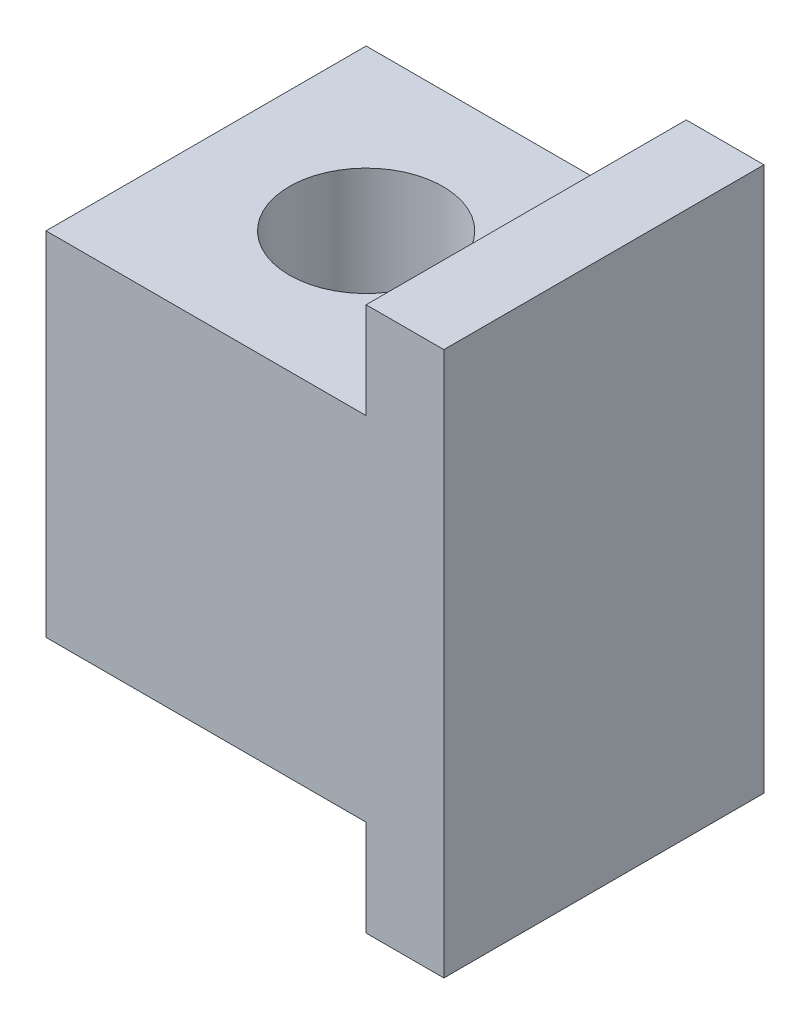
ISO-10303-21;
HEADER;
FILE_DESCRIPTION(('STEP AP214'),'2;1');
FILE_NAME('part.step','',(''),(''),'','','');
FILE_SCHEMA(('AUTOMOTIVE_DESIGN { 1 0 10303 214 1 1 1 1 }'));
ENDSEC;
DATA;
#1=APPLICATION_CONTEXT('core data for automotive mechanical design processes');
#2=APPLICATION_PROTOCOL_DEFINITION('international standard','automotive_design',2000,#1);
#3=PRODUCT_CONTEXT('',#1,'mechanical');
#4=PRODUCT('Part','Part','',(#3));
#5=PRODUCT_RELATED_PRODUCT_CATEGORY('part','',(#4));
#6=PRODUCT_DEFINITION_FORMATION('','',#4);
#7=PRODUCT_DEFINITION_CONTEXT('part definition',#1,'design');
#8=PRODUCT_DEFINITION('design','',#6,#7);
#9=PRODUCT_DEFINITION_SHAPE('','',#8);
#10=(LENGTH_UNIT() NAMED_UNIT(*) SI_UNIT(.MILLI.,.METRE.));
#11=(NAMED_UNIT(*) PLANE_ANGLE_UNIT() SI_UNIT($,.RADIAN.));
#12=(NAMED_UNIT(*) SI_UNIT($,.STERADIAN.) SOLID_ANGLE_UNIT());
#13=UNCERTAINTY_MEASURE_WITH_UNIT(LENGTH_MEASURE(1.E-05),#10,'distance_accuracy_value','');
#14=(GEOMETRIC_REPRESENTATION_CONTEXT(3) GLOBAL_UNCERTAINTY_ASSIGNED_CONTEXT((#13)) GLOBAL_UNIT_ASSIGNED_CONTEXT((#10,
#11,#12)) REPRESENTATION_CONTEXT('',''));
#15=CARTESIAN_POINT('',(0.,0.,0.));
#16=DIRECTION('',(0.,0.,1.));
#17=DIRECTION('',(1.,0.,0.));
#18=AXIS2_PLACEMENT_3D('',#15,#16,#17);
#19=CARTESIAN_POINT('',(0.,0.,12.7));
#20=DIRECTION('',(1.,0.,0.));
#21=DIRECTION('',(0.,0.,-1.));
#22=AXIS2_PLACEMENT_3D('',#19,#20,#21);
#23=PLANE('',#22);
#24=DIRECTION('',(0.,-1.,0.));
#25=VECTOR('',#24,1.);
#26=CARTESIAN_POINT('',(0.,0.,0.));
#27=LINE('',#26,#25);
#28=CARTESIAN_POINT('',(0.,0.,0.));
#29=VERTEX_POINT('',#28);
#30=CARTESIAN_POINT('',(0.,-13.97,0.));
#31=VERTEX_POINT('',#30);
#32=EDGE_CURVE('E140',#29,#31,#27,.T.);
#33=ORIENTED_EDGE('',*,*,#32,.T.);
#34=DIRECTION('',(0.,0.,-1.));
#35=VECTOR('',#34,1.);
#36=CARTESIAN_POINT('',(0.,-13.97,12.7));
#37=LINE('',#36,#35);
#38=CARTESIAN_POINT('',(0.,-13.97,12.7));
#39=VERTEX_POINT('',#38);
#40=EDGE_CURVE('E11',#39,#31,#37,.T.);
#41=ORIENTED_EDGE('',*,*,#40,.F.);
#42=DIRECTION('',(0.,-1.,0.));
#43=VECTOR('',#42,1.);
#44=CARTESIAN_POINT('',(0.,0.,12.7));
#45=LINE('',#44,#43);
#46=CARTESIAN_POINT('',(0.,0.,12.7));
#47=VERTEX_POINT('',#46);
#48=EDGE_CURVE('E163',#47,#39,#45,.T.);
#49=ORIENTED_EDGE('',*,*,#48,.F.);
#50=DIRECTION('',(0.,0.,-1.));
#51=VECTOR('',#50,1.);
#52=CARTESIAN_POINT('',(0.,0.,12.7));
#53=LINE('',#52,#51);
#54=EDGE_CURVE('E136',#47,#29,#53,.T.);
#55=ORIENTED_EDGE('',*,*,#54,.T.);
#56=EDGE_LOOP('',(#33,#41,#49,#55));
#57=FACE_BOUND('',#56,.T.);
#58=ADVANCED_FACE('F39',(#57),#23,.F.);
#59=CARTESIAN_POINT('',(0.,-13.97,12.7));
#60=DIRECTION('',(0.,1.,0.));
#61=DIRECTION('',(0.,0.,1.));
#62=AXIS2_PLACEMENT_3D('',#59,#60,#61);
#63=PLANE('',#62);
#64=CARTESIAN_POINT('',(6.35,-13.97,6.35));
#65=DIRECTION('',(0.,1.,0.));
#66=DIRECTION('',(0.,0.,1.));
#67=AXIS2_PLACEMENT_3D('',#64,#65,#66);
#68=CIRCLE('',#67,3.048);
#69=CARTESIAN_POINT('',(6.35,-13.97,9.398));
#70=VERTEX_POINT('',#69);
#71=EDGE_CURVE('E145',#70,#70,#68,.T.);
#72=ORIENTED_EDGE('',*,*,#71,.T.);
#73=EDGE_LOOP('',(#72));
#74=FACE_BOUND('',#73,.T.);
#75=DIRECTION('',(1.,0.,0.));
#76=VECTOR('',#75,1.);
#77=CARTESIAN_POINT('',(0.,-13.97,0.));
#78=LINE('',#77,#76);
#79=CARTESIAN_POINT('',(12.7,-13.97,0.));
#80=VERTEX_POINT('',#79);
#81=EDGE_CURVE('E144',#31,#80,#78,.T.);
#82=ORIENTED_EDGE('',*,*,#81,.T.);
#83=DIRECTION('',(0.,0.,-1.));
#84=VECTOR('',#83,1.);
#85=CARTESIAN_POINT('',(12.7,-13.97,12.7));
#86=LINE('',#85,#84);
#87=CARTESIAN_POINT('',(12.7,-13.97,12.7));
#88=VERTEX_POINT('',#87);
#89=EDGE_CURVE('E48',#88,#80,#86,.T.);
#90=ORIENTED_EDGE('',*,*,#89,.F.);
#91=DIRECTION('',(1.,0.,0.));
#92=VECTOR('',#91,1.);
#93=CARTESIAN_POINT('',(0.,-13.97,12.7));
#94=LINE('',#93,#92);
#95=EDGE_CURVE('E99',#39,#88,#94,.T.);
#96=ORIENTED_EDGE('',*,*,#95,.F.);
#97=ORIENTED_EDGE('',*,*,#40,.T.);
#98=EDGE_LOOP('',(#82,#90,#96,#97));
#99=FACE_BOUND('',#98,.T.);
#100=ADVANCED_FACE('F229',(#74,#99),#63,.F.);
#101=CARTESIAN_POINT('',(12.7,-17.78,12.7));
#102=DIRECTION('',(1.,0.,0.));
#103=DIRECTION('',(0.,1.,0.));
#104=AXIS2_PLACEMENT_3D('',#101,#102,#103);
#105=PLANE('',#104);
#106=DIRECTION('',(0.,-1.,0.));
#107=VECTOR('',#106,1.);
#108=CARTESIAN_POINT('',(12.7,-17.78,0.));
#109=LINE('',#108,#107);
#110=CARTESIAN_POINT('',(12.7,-17.78,0.));
#111=VERTEX_POINT('',#110);
#112=EDGE_CURVE('E148',#80,#111,#109,.T.);
#113=ORIENTED_EDGE('',*,*,#112,.T.);
#114=DIRECTION('',(0.,0.,-1.));
#115=VECTOR('',#114,1.);
#116=CARTESIAN_POINT('',(12.7,-17.78,12.7));
#117=LINE('',#116,#115);
#118=CARTESIAN_POINT('',(12.7,-17.78,12.7));
#119=VERTEX_POINT('',#118);
#120=EDGE_CURVE('E174',#119,#111,#117,.T.);
#121=ORIENTED_EDGE('',*,*,#120,.F.);
#122=DIRECTION('',(0.,-1.,0.));
#123=VECTOR('',#122,1.);
#124=CARTESIAN_POINT('',(12.7,-17.78,12.7));
#125=LINE('',#124,#123);
#126=EDGE_CURVE('E184',#88,#119,#125,.T.);
#127=ORIENTED_EDGE('',*,*,#126,.F.);
#128=ORIENTED_EDGE('',*,*,#89,.T.);
#129=EDGE_LOOP('',(#113,#121,#127,#128));
#130=FACE_BOUND('',#129,.T.);
#131=ADVANCED_FACE('F182',(#130),#105,.F.);
#132=CARTESIAN_POINT('',(15.7828234051938,-17.78,12.7));
#133=DIRECTION('',(0.,1.,0.));
#134=DIRECTION('',(0.,0.,1.));
#135=AXIS2_PLACEMENT_3D('',#132,#133,#134);
#136=PLANE('',#135);
#137=DIRECTION('',(1.,0.,0.));
#138=VECTOR('',#137,1.);
#139=CARTESIAN_POINT('',(15.7828234051938,-17.78,0.));
#140=LINE('',#139,#138);
#141=CARTESIAN_POINT('',(15.7828234051938,-17.78,0.));
#142=VERTEX_POINT('',#141);
#143=EDGE_CURVE('E151',#111,#142,#140,.T.);
#144=ORIENTED_EDGE('',*,*,#143,.T.);
#145=DIRECTION('',(0.,0.,-1.));
#146=VECTOR('',#145,1.);
#147=CARTESIAN_POINT('',(15.7828234051938,-17.78,12.7));
#148=LINE('',#147,#146);
#149=CARTESIAN_POINT('',(15.7828234051938,-17.78,12.7));
#150=VERTEX_POINT('',#149);
#151=EDGE_CURVE('E170',#150,#142,#148,.T.);
#152=ORIENTED_EDGE('',*,*,#151,.F.);
#153=DIRECTION('',(1.,0.,0.));
#154=VECTOR('',#153,1.);
#155=CARTESIAN_POINT('',(15.7828234051938,-17.78,12.7));
#156=LINE('',#155,#154);
#157=EDGE_CURVE('E197',#119,#150,#156,.T.);
#158=ORIENTED_EDGE('',*,*,#157,.F.);
#159=ORIENTED_EDGE('',*,*,#120,.T.);
#160=EDGE_LOOP('',(#144,#152,#158,#159));
#161=FACE_BOUND('',#160,.T.);
#162=ADVANCED_FACE('F192',(#161),#136,.F.);
#163=CARTESIAN_POINT('',(15.7828234051938,3.81,12.7));
#164=DIRECTION('',(-1.,0.,0.));
#165=DIRECTION('',(0.,-1.,0.));
#166=AXIS2_PLACEMENT_3D('',#163,#164,#165);
#167=PLANE('',#166);
#168=DIRECTION('',(0.,1.,0.));
#169=VECTOR('',#168,1.);
#170=CARTESIAN_POINT('',(15.7828234051938,3.81,0.));
#171=LINE('',#170,#169);
#172=CARTESIAN_POINT('',(15.7828234051938,3.81,0.));
#173=VERTEX_POINT('',#172);
#174=EDGE_CURVE('E154',#142,#173,#171,.T.);
#175=ORIENTED_EDGE('',*,*,#174,.T.);
#176=DIRECTION('',(0.,0.,-1.));
#177=VECTOR('',#176,1.);
#178=CARTESIAN_POINT('',(15.7828234051938,3.81,12.7));
#179=LINE('',#178,#177);
#180=CARTESIAN_POINT('',(15.7828234051938,3.81,12.7));
#181=VERTEX_POINT('',#180);
#182=EDGE_CURVE('E129',#181,#173,#179,.T.);
#183=ORIENTED_EDGE('',*,*,#182,.F.);
#184=DIRECTION('',(0.,1.,0.));
#185=VECTOR('',#184,1.);
#186=CARTESIAN_POINT('',(15.7828234051938,3.81,12.7));
#187=LINE('',#186,#185);
#188=EDGE_CURVE('E118',#150,#181,#187,.T.);
#189=ORIENTED_EDGE('',*,*,#188,.F.);
#190=ORIENTED_EDGE('',*,*,#151,.T.);
#191=EDGE_LOOP('',(#175,#183,#189,#190));
#192=FACE_BOUND('',#191,.T.);
#193=ADVANCED_FACE('F195',(#192),#167,.F.);
#194=CARTESIAN_POINT('',(12.7,3.81,12.7));
#195=DIRECTION('',(0.,-1.,0.));
#196=DIRECTION('',(0.,0.,-1.));
#197=AXIS2_PLACEMENT_3D('',#194,#195,#196);
#198=PLANE('',#197);
#199=DIRECTION('',(-1.,0.,0.));
#200=VECTOR('',#199,1.);
#201=CARTESIAN_POINT('',(12.7,3.81,0.));
#202=LINE('',#201,#200);
#203=CARTESIAN_POINT('',(12.7,3.81,0.));
#204=VERTEX_POINT('',#203);
#205=EDGE_CURVE('E127',#173,#204,#202,.T.);
#206=ORIENTED_EDGE('',*,*,#205,.T.);
#207=DIRECTION('',(0.,0.,-1.));
#208=VECTOR('',#207,1.);
#209=CARTESIAN_POINT('',(12.7,3.81,12.7));
#210=LINE('',#209,#208);
#211=CARTESIAN_POINT('',(12.7,3.81,12.7));
#212=VERTEX_POINT('',#211);
#213=EDGE_CURVE('E124',#212,#204,#210,.T.);
#214=ORIENTED_EDGE('',*,*,#213,.F.);
#215=DIRECTION('',(-1.,0.,0.));
#216=VECTOR('',#215,1.);
#217=CARTESIAN_POINT('',(12.7,3.81,12.7));
#218=LINE('',#217,#216);
#219=EDGE_CURVE('E112',#181,#212,#218,.T.);
#220=ORIENTED_EDGE('',*,*,#219,.F.);
#221=ORIENTED_EDGE('',*,*,#182,.T.);
#222=EDGE_LOOP('',(#206,#214,#220,#221));
#223=FACE_BOUND('',#222,.T.);
#224=ADVANCED_FACE('F125',(#223),#198,.F.);
#225=CARTESIAN_POINT('',(12.7,0.,12.7));
#226=DIRECTION('',(1.,0.,0.));
#227=DIRECTION('',(0.,0.,-1.));
#228=AXIS2_PLACEMENT_3D('',#225,#226,#227);
#229=PLANE('',#228);
#230=DIRECTION('',(0.,-1.,0.));
#231=VECTOR('',#230,1.);
#232=CARTESIAN_POINT('',(12.7,0.,0.));
#233=LINE('',#232,#231);
#234=CARTESIAN_POINT('',(12.7,0.,0.));
#235=VERTEX_POINT('',#234);
#236=EDGE_CURVE('E85',#204,#235,#233,.T.);
#237=ORIENTED_EDGE('',*,*,#236,.T.);
#238=DIRECTION('',(0.,0.,-1.));
#239=VECTOR('',#238,1.);
#240=CARTESIAN_POINT('',(12.7,0.,12.7));
#241=LINE('',#240,#239);
#242=CARTESIAN_POINT('',(12.7,0.,12.7));
#243=VERTEX_POINT('',#242);
#244=EDGE_CURVE('E130',#243,#235,#241,.T.);
#245=ORIENTED_EDGE('',*,*,#244,.F.);
#246=DIRECTION('',(0.,-1.,0.));
#247=VECTOR('',#246,1.);
#248=CARTESIAN_POINT('',(12.7,0.,12.7));
#249=LINE('',#248,#247);
#250=EDGE_CURVE('E116',#212,#243,#249,.T.);
#251=ORIENTED_EDGE('',*,*,#250,.F.);
#252=ORIENTED_EDGE('',*,*,#213,.T.);
#253=EDGE_LOOP('',(#237,#245,#251,#252));
#254=FACE_BOUND('',#253,.T.);
#255=ADVANCED_FACE('F132',(#254),#229,.F.);
#256=CARTESIAN_POINT('',(0.,0.,12.7));
#257=DIRECTION('',(0.,-1.,0.));
#258=DIRECTION('',(0.,0.,-1.));
#259=AXIS2_PLACEMENT_3D('',#256,#257,#258);
#260=PLANE('',#259);
#261=CARTESIAN_POINT('',(6.35,0.,6.35));
#262=DIRECTION('',(0.,1.,0.));
#263=DIRECTION('',(0.,0.,1.));
#264=AXIS2_PLACEMENT_3D('',#261,#262,#263);
#265=CIRCLE('',#264,3.048);
#266=CARTESIAN_POINT('',(6.35,0.,9.398));
#267=VERTEX_POINT('',#266);
#268=EDGE_CURVE('E210',#267,#267,#265,.T.);
#269=ORIENTED_EDGE('',*,*,#268,.F.);
#270=EDGE_LOOP('',(#269));
#271=FACE_BOUND('',#270,.T.);
#272=DIRECTION('',(-1.,0.,0.));
#273=VECTOR('',#272,1.);
#274=CARTESIAN_POINT('',(0.,0.,0.));
#275=LINE('',#274,#273);
#276=EDGE_CURVE('E91',#235,#29,#275,.T.);
#277=ORIENTED_EDGE('',*,*,#276,.T.);
#278=ORIENTED_EDGE('',*,*,#54,.F.);
#279=DIRECTION('',(-1.,0.,0.));
#280=VECTOR('',#279,1.);
#281=CARTESIAN_POINT('',(0.,0.,12.7));
#282=LINE('',#281,#280);
#283=EDGE_CURVE('E56',#243,#47,#282,.T.);
#284=ORIENTED_EDGE('',*,*,#283,.F.);
#285=ORIENTED_EDGE('',*,*,#244,.T.);
#286=EDGE_LOOP('',(#277,#278,#284,#285));
#287=FACE_BOUND('',#286,.T.);
#288=ADVANCED_FACE('F218',(#271,#287),#260,.F.);
#289=CARTESIAN_POINT('',(0.,0.,12.7));
#290=DIRECTION('',(0.,0.,1.));
#291=DIRECTION('',(1.,0.,0.));
#292=AXIS2_PLACEMENT_3D('',#289,#290,#291);
#293=PLANE('',#292);
#294=ORIENTED_EDGE('',*,*,#48,.T.);
#295=ORIENTED_EDGE('',*,*,#95,.T.);
#296=ORIENTED_EDGE('',*,*,#126,.T.);
#297=ORIENTED_EDGE('',*,*,#157,.T.);
#298=ORIENTED_EDGE('',*,*,#188,.T.);
#299=ORIENTED_EDGE('',*,*,#219,.T.);
#300=ORIENTED_EDGE('',*,*,#250,.T.);
#301=ORIENTED_EDGE('',*,*,#283,.T.);
#302=EDGE_LOOP('',(#294,#295,#296,#297,#298,#299,#300,#301));
#303=FACE_BOUND('',#302,.T.);
#304=ADVANCED_FACE('F114',(#303),#293,.T.);
#305=CARTESIAN_POINT('',(0.,0.,0.));
#306=DIRECTION('',(0.,0.,1.));
#307=DIRECTION('',(1.,0.,0.));
#308=AXIS2_PLACEMENT_3D('',#305,#306,#307);
#309=PLANE('',#308);
#310=ORIENTED_EDGE('',*,*,#32,.F.);
#311=ORIENTED_EDGE('',*,*,#276,.F.);
#312=ORIENTED_EDGE('',*,*,#236,.F.);
#313=ORIENTED_EDGE('',*,*,#205,.F.);
#314=ORIENTED_EDGE('',*,*,#174,.F.);
#315=ORIENTED_EDGE('',*,*,#143,.F.);
#316=ORIENTED_EDGE('',*,*,#112,.F.);
#317=ORIENTED_EDGE('',*,*,#81,.F.);
#318=EDGE_LOOP('',(#310,#311,#312,#313,#314,#315,#316,#317));
#319=FACE_BOUND('',#318,.T.);
#320=ADVANCED_FACE('F188',(#319),#309,.F.);
#321=CARTESIAN_POINT('',(6.35,-17.78,6.35));
#322=DIRECTION('',(0.,1.,0.));
#323=DIRECTION('',(0.,0.,1.));
#324=AXIS2_PLACEMENT_3D('',#321,#322,#323);
#325=CYLINDRICAL_SURFACE('',#324,3.048);
#326=CARTESIAN_POINT('',(6.35,0.,9.398));
#327=CARTESIAN_POINT('',(6.35,-0.145520833333334,9.398));
#328=CARTESIAN_POINT('',(6.35,-0.291041666666667,9.398));
#329=CARTESIAN_POINT('',(6.35,-0.582083333333334,9.398));
#330=CARTESIAN_POINT('',(6.35,-0.727604166666666,9.398));
#331=CARTESIAN_POINT('',(6.35,-1.01864583333333,9.398));
#332=CARTESIAN_POINT('',(6.35,-1.16416666666667,9.398));
#333=CARTESIAN_POINT('',(6.35,-1.45520833333333,9.398));
#334=CARTESIAN_POINT('',(6.35,-1.60072916666667,9.398));
#335=CARTESIAN_POINT('',(6.35,-1.89177083333333,9.398));
#336=CARTESIAN_POINT('',(6.35,-2.03729166666667,9.398));
#337=CARTESIAN_POINT('',(6.35,-2.32833333333333,9.398));
#338=CARTESIAN_POINT('',(6.35,-2.47385416666667,9.398));
#339=CARTESIAN_POINT('',(6.35,-2.76489583333333,9.398));
#340=CARTESIAN_POINT('',(6.35,-2.91041666666667,9.398));
#341=CARTESIAN_POINT('',(6.35,-3.20145833333333,9.398));
#342=CARTESIAN_POINT('',(6.35,-3.34697916666667,9.398));
#343=CARTESIAN_POINT('',(6.35,-3.63802083333333,9.398));
#344=CARTESIAN_POINT('',(6.35,-3.78354166666667,9.398));
#345=CARTESIAN_POINT('',(6.35,-4.07458333333333,9.398));
#346=CARTESIAN_POINT('',(6.35,-4.22010416666667,9.398));
#347=CARTESIAN_POINT('',(6.35,-4.51114583333333,9.398));
#348=CARTESIAN_POINT('',(6.35,-4.65666666666667,9.398));
#349=CARTESIAN_POINT('',(6.35,-4.94770833333333,9.398));
#350=CARTESIAN_POINT('',(6.35,-5.09322916666667,9.398));
#351=CARTESIAN_POINT('',(6.35,-5.38427083333333,9.398));
#352=CARTESIAN_POINT('',(6.35,-5.52979166666667,9.398));
#353=CARTESIAN_POINT('',(6.35,-5.82083333333333,9.398));
#354=CARTESIAN_POINT('',(6.35,-5.96635416666667,9.398));
#355=CARTESIAN_POINT('',(6.35,-6.25739583333333,9.398));
#356=CARTESIAN_POINT('',(6.35,-6.40291666666667,9.398));
#357=CARTESIAN_POINT('',(6.35,-6.69395833333333,9.398));
#358=CARTESIAN_POINT('',(6.35,-6.83947916666667,9.398));
#359=CARTESIAN_POINT('',(6.35,-7.13052083333333,9.398));
#360=CARTESIAN_POINT('',(6.35,-7.27604166666667,9.398));
#361=CARTESIAN_POINT('',(6.35,-7.56708333333333,9.398));
#362=CARTESIAN_POINT('',(6.35,-7.71260416666667,9.398));
#363=CARTESIAN_POINT('',(6.35,-8.00364583333334,9.398));
#364=CARTESIAN_POINT('',(6.35,-8.14916666666667,9.398));
#365=CARTESIAN_POINT('',(6.35,-8.44020833333333,9.398));
#366=CARTESIAN_POINT('',(6.35,-8.58572916666667,9.398));
#367=CARTESIAN_POINT('',(6.35,-8.87677083333334,9.398));
#368=CARTESIAN_POINT('',(6.35,-9.02229166666667,9.398));
#369=CARTESIAN_POINT('',(6.35,-9.31333333333333,9.398));
#370=CARTESIAN_POINT('',(6.35,-9.45885416666667,9.398));
#371=CARTESIAN_POINT('',(6.35,-9.74989583333334,9.398));
#372=CARTESIAN_POINT('',(6.35,-9.89541666666667,9.398));
#373=CARTESIAN_POINT('',(6.35,-10.1864583333333,9.398));
#374=CARTESIAN_POINT('',(6.35,-10.3319791666667,9.398));
#375=CARTESIAN_POINT('',(6.35,-10.6230208333333,9.398));
#376=CARTESIAN_POINT('',(6.35,-10.7685416666667,9.398));
#377=CARTESIAN_POINT('',(6.35,-11.0595833333333,9.398));
#378=CARTESIAN_POINT('',(6.35,-11.2051041666667,9.398));
#379=CARTESIAN_POINT('',(6.35,-11.4961458333333,9.398));
#380=CARTESIAN_POINT('',(6.35,-11.6416666666667,9.398));
#381=CARTESIAN_POINT('',(6.35,-11.9327083333333,9.398));
#382=CARTESIAN_POINT('',(6.35,-12.0782291666667,9.398));
#383=CARTESIAN_POINT('',(6.35,-12.3692708333333,9.398));
#384=CARTESIAN_POINT('',(6.35,-12.5147916666667,9.398));
#385=CARTESIAN_POINT('',(6.35,-12.8058333333333,9.398));
#386=CARTESIAN_POINT('',(6.35,-12.9513541666667,9.398));
#387=CARTESIAN_POINT('',(6.35,-13.2423958333333,9.398));
#388=CARTESIAN_POINT('',(6.35,-13.3879166666667,9.398));
#389=CARTESIAN_POINT('',(6.35,-13.6789583333333,9.398));
#390=CARTESIAN_POINT('',(6.35,-13.8244791666667,9.398));
#391=CARTESIAN_POINT('',(6.35,-13.97,9.398));
#392=B_SPLINE_CURVE_WITH_KNOTS('',3,(#326,#327,#328,#329,#330,#331,#332,#333,#334,#335,#336,
#337,#338,#339,#340,#341,#342,#343,#344,#345,#346,#347,#348,#349,#350,#351,#352,#353,#354,#355,
#356,#357,#358,#359,#360,#361,#362,#363,#364,#365,#366,#367,#368,#369,#370,#371,#372,#373,#374,
#375,#376,#377,#378,#379,#380,#381,#382,#383,#384,#385,#386,#387,#388,#389,#390,#391),
.UNSPECIFIED.,.F.,.F.,(4,2,2,2,2,2,2,2,2,2,2,2,2,2,2,2,2,2,2,2,2,2,2,2,2,2,2,2,2,2,2,2,4),(0.,
0.436562500000001,0.873124999999999,1.3096875,1.74625,2.1828125,2.619375,3.0559375,3.4925,
3.9290625,4.365625,4.8021875,5.23875,5.6753125,6.111875,6.5484375,6.985,7.4215625,7.858125,
8.2946875,8.73125,9.1678125,9.604375,10.0409375,10.4775,10.9140625,11.350625,11.7871875,
12.22375,12.6603125,13.096875,13.5334375,13.97),.UNSPECIFIED.);
#393=EDGE_CURVE('BSEAM215',#267,#70,#392,.T.);
#394=ORIENTED_EDGE('',*,*,#268,.T.);
#395=ORIENTED_EDGE('',*,*,#71,.F.);
#396=ORIENTED_EDGE('',*,*,#393,.T.);
#397=ORIENTED_EDGE('',*,*,#393,.F.);
#398=EDGE_LOOP('',(#394,#396,#395,#397));
#399=FACE_BOUND('',#398,.T.);
#400=ADVANCED_FACE('F215',(#399),#325,.F.);
#401=CLOSED_SHELL('',(#58,#100,#131,#162,#193,#224,#255,#288,#304,#320,#400));
#402=MANIFOLD_SOLID_BREP('B2',#401);
#403=ADVANCED_BREP_SHAPE_REPRESENTATION('',(#18,#402),#14);
#404=SHAPE_DEFINITION_REPRESENTATION(#9,#403);
ENDSEC;
END-ISO-10303-21;
